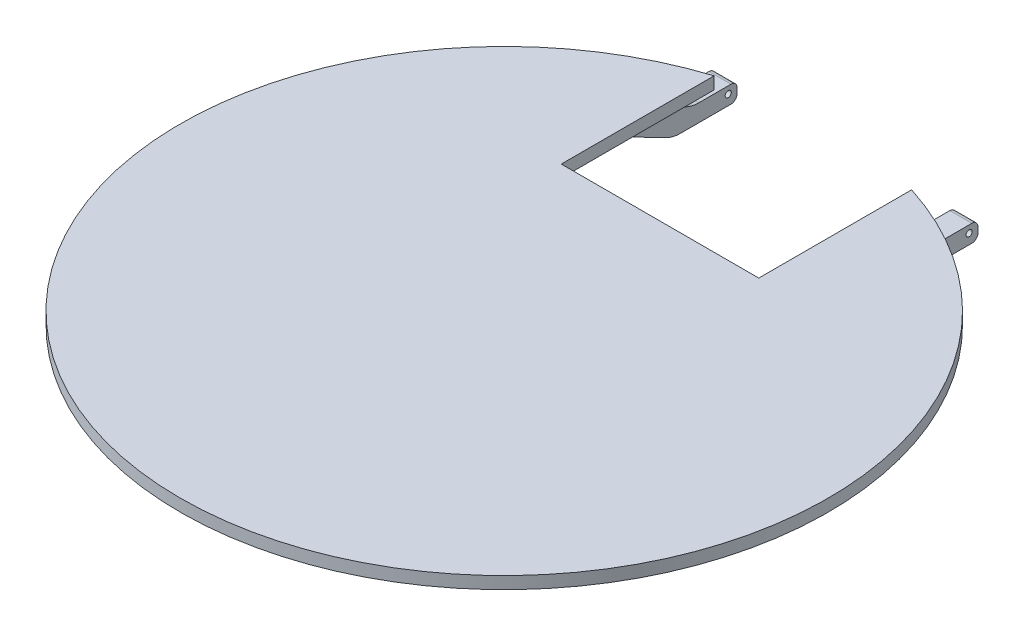
ISO-10303-21;
HEADER;
FILE_DESCRIPTION(('STEP AP214'),'2;1');
FILE_NAME('part.step','',(''),(''),'','','');
FILE_SCHEMA(('AUTOMOTIVE_DESIGN { 1 0 10303 214 1 1 1 1 }'));
ENDSEC;
DATA;
#1=APPLICATION_CONTEXT('core data for automotive mechanical design processes');
#2=APPLICATION_PROTOCOL_DEFINITION('international standard','automotive_design',2000,#1);
#3=PRODUCT_CONTEXT('',#1,'mechanical');
#4=PRODUCT('Part','Part','',(#3));
#5=PRODUCT_RELATED_PRODUCT_CATEGORY('part','',(#4));
#6=PRODUCT_DEFINITION_FORMATION('','',#4);
#7=PRODUCT_DEFINITION_CONTEXT('part definition',#1,'design');
#8=PRODUCT_DEFINITION('design','',#6,#7);
#9=PRODUCT_DEFINITION_SHAPE('','',#8);
#10=(LENGTH_UNIT() NAMED_UNIT(*) SI_UNIT(.MILLI.,.METRE.));
#11=(NAMED_UNIT(*) PLANE_ANGLE_UNIT() SI_UNIT($,.RADIAN.));
#12=(NAMED_UNIT(*) SI_UNIT($,.STERADIAN.) SOLID_ANGLE_UNIT());
#13=UNCERTAINTY_MEASURE_WITH_UNIT(LENGTH_MEASURE(1.E-05),#10,'distance_accuracy_value','');
#14=(GEOMETRIC_REPRESENTATION_CONTEXT(3) GLOBAL_UNCERTAINTY_ASSIGNED_CONTEXT((#13)) GLOBAL_UNIT_ASSIGNED_CONTEXT((#10,
#11,#12)) REPRESENTATION_CONTEXT('',''));
#15=CARTESIAN_POINT('',(0.,0.,0.));
#16=DIRECTION('',(0.,0.,1.));
#17=DIRECTION('',(1.,0.,0.));
#18=AXIS2_PLACEMENT_3D('',#15,#16,#17);
#19=CARTESIAN_POINT('',(-35.8,-6.63397180873605,-109.968629526497));
#20=DIRECTION('',(-1.,0.,0.));
#21=DIRECTION('',(0.,0.,1.));
#22=AXIS2_PLACEMENT_3D('',#19,#20,#21);
#23=CYLINDRICAL_SURFACE('',#22,2.);
#24=CARTESIAN_POINT('',(-43.,-6.63397180873605,-109.968629526497));
#25=DIRECTION('',(-1.,0.,0.));
#26=DIRECTION('',(0.,0.,1.));
#27=AXIS2_PLACEMENT_3D('',#24,#25,#26);
#28=CIRCLE('',#27,2.);
#29=CARTESIAN_POINT('',(-43.,-6.63397180873607,-111.968629526497));
#30=VERTEX_POINT('',#29);
#31=CARTESIAN_POINT('',(-43.,-4.63397180873605,-109.968629526497));
#32=VERTEX_POINT('',#31);
#33=EDGE_CURVE('E166',#30,#32,#28,.F.);
#34=ORIENTED_EDGE('',*,*,#33,.T.);
#35=DIRECTION('',(-1.,0.,0.));
#36=VECTOR('',#35,1.);
#37=CARTESIAN_POINT('',(-35.8,-4.63397180873605,-109.968629526497));
#38=LINE('',#37,#36);
#39=CARTESIAN_POINT('',(-35.8,-4.63397180873605,-109.968629526497));
#40=VERTEX_POINT('',#39);
#41=EDGE_CURVE('E12',#40,#32,#38,.T.);
#42=ORIENTED_EDGE('',*,*,#41,.F.);
#43=CARTESIAN_POINT('',(-35.8,-6.63397180873605,-109.968629526497));
#44=DIRECTION('',(-1.,0.,0.));
#45=DIRECTION('',(0.,0.,1.));
#46=AXIS2_PLACEMENT_3D('',#43,#44,#45);
#47=CIRCLE('',#46,2.);
#48=CARTESIAN_POINT('',(-35.8,-6.63397180873607,-111.968629526497));
#49=VERTEX_POINT('',#48);
#50=EDGE_CURVE('E188',#49,#40,#47,.F.);
#51=ORIENTED_EDGE('',*,*,#50,.F.);
#52=DIRECTION('',(-1.,0.,0.));
#53=VECTOR('',#52,1.);
#54=CARTESIAN_POINT('',(-35.8,-6.63397180873607,-111.968629526497));
#55=LINE('',#54,#53);
#56=EDGE_CURVE('E57',#49,#30,#55,.T.);
#57=ORIENTED_EDGE('',*,*,#56,.T.);
#58=EDGE_LOOP('',(#34,#42,#51,#57));
#59=FACE_BOUND('',#58,.T.);
#60=ADVANCED_FACE('F54',(#59),#23,.T.);
#61=CARTESIAN_POINT('',(-35.8,-4.63397180873605,0.));
#62=DIRECTION('',(0.,-1.,0.));
#63=DIRECTION('',(0.,0.,-1.));
#64=AXIS2_PLACEMENT_3D('',#61,#62,#63);
#65=PLANE('',#64);
#66=DIRECTION('',(0.,0.,1.));
#67=VECTOR('',#66,1.);
#68=CARTESIAN_POINT('',(-43.,-4.63397180873605,0.));
#69=LINE('',#68,#67);
#70=CARTESIAN_POINT('',(-43.,-4.63397180873605,-99.4675312207481));
#71=VERTEX_POINT('',#70);
#72=EDGE_CURVE('E103',#32,#71,#69,.T.);
#73=ORIENTED_EDGE('',*,*,#72,.T.);
#74=DIRECTION('',(-1.,0.,0.));
#75=VECTOR('',#74,1.);
#76=CARTESIAN_POINT('',(-35.8,-4.63397180873605,-99.4675312207481));
#77=LINE('',#76,#75);
#78=CARTESIAN_POINT('',(-35.8,-4.63397180873605,-99.4675312207481));
#79=VERTEX_POINT('',#78);
#80=EDGE_CURVE('E63',#79,#71,#77,.T.);
#81=ORIENTED_EDGE('',*,*,#80,.F.);
#82=DIRECTION('',(0.,0.,1.));
#83=VECTOR('',#82,1.);
#84=CARTESIAN_POINT('',(-35.8,-4.63397180873605,0.));
#85=LINE('',#84,#83);
#86=EDGE_CURVE('E71',#40,#79,#85,.T.);
#87=ORIENTED_EDGE('',*,*,#86,.F.);
#88=ORIENTED_EDGE('',*,*,#41,.T.);
#89=EDGE_LOOP('',(#73,#81,#87,#88));
#90=FACE_BOUND('',#89,.T.);
#91=ADVANCED_FACE('F229',(#90),#65,.F.);
#92=CARTESIAN_POINT('',(-35.8,5.36602819126395,-99.4675312207481));
#93=DIRECTION('',(-1.,0.,0.));
#94=DIRECTION('',(0.,0.,1.));
#95=AXIS2_PLACEMENT_3D('',#92,#93,#94);
#96=CYLINDRICAL_SURFACE('',#95,10.);
#97=CARTESIAN_POINT('',(-43.,5.36602819126395,-99.4675312207481));
#98=DIRECTION('',(-1.,0.,0.));
#99=DIRECTION('',(0.,0.,1.));
#100=AXIS2_PLACEMENT_3D('',#97,#98,#99);
#101=CIRCLE('',#100,10.);
#102=CARTESIAN_POINT('',(-43.,-0.854213860581016,-91.6375510920083));
#103=VERTEX_POINT('',#102);
#104=EDGE_CURVE('E148',#71,#103,#101,.T.);
#105=ORIENTED_EDGE('',*,*,#104,.T.);
#106=DIRECTION('',(-1.,0.,0.));
#107=VECTOR('',#106,1.);
#108=CARTESIAN_POINT('',(-35.8,-0.854213860581016,-91.6375510920083));
#109=LINE('',#108,#107);
#110=CARTESIAN_POINT('',(-35.8,-0.854213860581016,-91.6375510920083));
#111=VERTEX_POINT('',#110);
#112=EDGE_CURVE('E146',#111,#103,#109,.T.);
#113=ORIENTED_EDGE('',*,*,#112,.F.);
#114=CARTESIAN_POINT('',(-35.8,5.36602819126395,-99.4675312207481));
#115=DIRECTION('',(-1.,0.,0.));
#116=DIRECTION('',(0.,0.,1.));
#117=AXIS2_PLACEMENT_3D('',#114,#115,#116);
#118=CIRCLE('',#117,10.);
#119=EDGE_CURVE('E135',#79,#111,#118,.T.);
#120=ORIENTED_EDGE('',*,*,#119,.F.);
#121=ORIENTED_EDGE('',*,*,#80,.T.);
#122=EDGE_LOOP('',(#105,#113,#120,#121));
#123=FACE_BOUND('',#122,.T.);
#124=ADVANCED_FACE('F147',(#123),#96,.F.);
#125=CARTESIAN_POINT('',(-35.8,44.3009860685289,-55.7656499070269));
#126=DIRECTION('',(0.,-0.622024205184502,0.782998012873972));
#127=DIRECTION('',(0.,-0.782998012873972,-0.622024205184502));
#128=AXIS2_PLACEMENT_3D('',#125,#126,#127);
#129=PLANE('',#128);
#130=DIRECTION('',(0.,0.782998012873972,0.622024205184502));
#131=VECTOR('',#130,1.);
#132=CARTESIAN_POINT('',(-43.,44.3009860685289,-55.7656499070269));
#133=LINE('',#132,#131);
#134=CARTESIAN_POINT('',(-43.,0.,-90.9589520547832));
#135=VERTEX_POINT('',#134);
#136=EDGE_CURVE('E182',#103,#135,#133,.T.);
#137=ORIENTED_EDGE('',*,*,#136,.T.);
#138=DIRECTION('',(-1.,0.,0.));
#139=VECTOR('',#138,1.);
#140=CARTESIAN_POINT('',(-35.8,0.,-90.9589520547832));
#141=LINE('',#140,#139);
#142=CARTESIAN_POINT('',(-35.8,0.,-90.9589520547832));
#143=VERTEX_POINT('',#142);
#144=EDGE_CURVE('E152',#143,#135,#141,.T.);
#145=ORIENTED_EDGE('',*,*,#144,.F.);
#146=DIRECTION('',(0.,0.782998012873972,0.622024205184502));
#147=VECTOR('',#146,1.);
#148=CARTESIAN_POINT('',(-35.8,44.3009860685289,-55.7656499070269));
#149=LINE('',#148,#147);
#150=EDGE_CURVE('E141',#111,#143,#149,.T.);
#151=ORIENTED_EDGE('',*,*,#150,.F.);
#152=ORIENTED_EDGE('',*,*,#112,.T.);
#153=EDGE_LOOP('',(#137,#145,#151,#152));
#154=FACE_BOUND('',#153,.T.);
#155=ADVANCED_FACE('F154',(#154),#129,.F.);
#156=CARTESIAN_POINT('',(-35.8,0.,0.));
#157=DIRECTION('',(0.,1.,0.));
#158=DIRECTION('',(0.,0.,1.));
#159=AXIS2_PLACEMENT_3D('',#156,#157,#158);
#160=PLANE('',#159);
#161=DIRECTION('',(0.,0.,-1.));
#162=VECTOR('',#161,1.);
#163=CARTESIAN_POINT('',(-43.,0.,0.));
#164=LINE('',#163,#162);
#165=CARTESIAN_POINT('',(-43.,0.,-70.9589520547832));
#166=VERTEX_POINT('',#165);
#167=EDGE_CURVE('E179',#166,#135,#164,.T.);
#168=ORIENTED_EDGE('',*,*,#167,.F.);
#169=DIRECTION('',(-1.,0.,0.));
#170=VECTOR('',#169,1.);
#171=CARTESIAN_POINT('',(-35.8,0.,-70.9589520547832));
#172=LINE('',#171,#170);
#173=CARTESIAN_POINT('',(-35.8,0.,-70.9589520547832));
#174=VERTEX_POINT('',#173);
#175=EDGE_CURVE('E192',#174,#166,#172,.T.);
#176=ORIENTED_EDGE('',*,*,#175,.F.);
#177=DIRECTION('',(0.,0.,-1.));
#178=VECTOR('',#177,1.);
#179=CARTESIAN_POINT('',(-35.8,0.,0.));
#180=LINE('',#179,#178);
#181=EDGE_CURVE('E156',#174,#143,#180,.T.);
#182=ORIENTED_EDGE('',*,*,#181,.T.);
#183=ORIENTED_EDGE('',*,*,#144,.T.);
#184=EDGE_LOOP('',(#168,#176,#182,#183));
#185=FACE_BOUND('',#184,.T.);
#186=ADVANCED_FACE('F242',(#185),#160,.T.);
#187=CARTESIAN_POINT('',(-35.8,28.8860608717184,-14.8787792796203));
#188=DIRECTION('',(0.,0.888998595713218,-0.457909922168025));
#189=DIRECTION('',(0.,0.457909922168025,0.888998595713218));
#190=AXIS2_PLACEMENT_3D('',#187,#188,#189);
#191=PLANE('',#190);
#192=DIRECTION('',(0.,-0.457909922168025,-0.888998595713218));
#193=VECTOR('',#192,1.);
#194=CARTESIAN_POINT('',(-43.,28.8860608717184,-14.8787792796203));
#195=LINE('',#194,#193);
#196=CARTESIAN_POINT('',(-43.,-9.19168776804803,-88.8039410415705));
#197=VERTEX_POINT('',#196);
#198=EDGE_CURVE('E177',#166,#197,#195,.T.);
#199=ORIENTED_EDGE('',*,*,#198,.T.);
#200=DIRECTION('',(-1.,0.,0.));
#201=VECTOR('',#200,1.);
#202=CARTESIAN_POINT('',(-35.8,-9.19168776804803,-88.8039410415705));
#203=LINE('',#202,#201);
#204=CARTESIAN_POINT('',(-35.8,-9.19168776804803,-88.8039410415705));
#205=VERTEX_POINT('',#204);
#206=EDGE_CURVE('E194',#205,#197,#203,.T.);
#207=ORIENTED_EDGE('',*,*,#206,.F.);
#208=DIRECTION('',(0.,-0.457909922168025,-0.888998595713218));
#209=VECTOR('',#208,1.);
#210=CARTESIAN_POINT('',(-35.8,28.8860608717184,-14.8787792796203));
#211=LINE('',#210,#209);
#212=EDGE_CURVE('E158',#174,#205,#211,.T.);
#213=ORIENTED_EDGE('',*,*,#212,.F.);
#214=ORIENTED_EDGE('',*,*,#175,.T.);
#215=EDGE_LOOP('',(#199,#207,#213,#214));
#216=FACE_BOUND('',#215,.T.);
#217=ADVANCED_FACE('F245',(#216),#191,.F.);
#218=CARTESIAN_POINT('',(-35.8,-0.301701810915867,-93.3830402632507));
#219=DIRECTION('',(-1.,0.,0.));
#220=DIRECTION('',(0.,0.,1.));
#221=AXIS2_PLACEMENT_3D('',#218,#219,#220);
#222=CYLINDRICAL_SURFACE('',#221,10.);
#223=CARTESIAN_POINT('',(-43.,-0.301701810915867,-93.3830402632507));
#224=DIRECTION('',(-1.,0.,0.));
#225=DIRECTION('',(0.,0.,1.));
#226=AXIS2_PLACEMENT_3D('',#223,#224,#225);
#227=CIRCLE('',#226,10.);
#228=CARTESIAN_POINT('',(-43.,-10.3017018109159,-93.3830402632508));
#229=VERTEX_POINT('',#228);
#230=EDGE_CURVE('E175',#197,#229,#227,.F.);
#231=ORIENTED_EDGE('',*,*,#230,.T.);
#232=DIRECTION('',(-1.,0.,0.));
#233=VECTOR('',#232,1.);
#234=CARTESIAN_POINT('',(-35.8,-10.3017018109159,-93.3830402632508));
#235=LINE('',#234,#233);
#236=CARTESIAN_POINT('',(-35.8,-10.3017018109159,-93.3830402632508));
#237=VERTEX_POINT('',#236);
#238=EDGE_CURVE('E197',#237,#229,#235,.T.);
#239=ORIENTED_EDGE('',*,*,#238,.F.);
#240=CARTESIAN_POINT('',(-35.8,-0.301701810915867,-93.3830402632507));
#241=DIRECTION('',(-1.,0.,0.));
#242=DIRECTION('',(0.,0.,1.));
#243=AXIS2_PLACEMENT_3D('',#240,#241,#242);
#244=CIRCLE('',#243,10.);
#245=EDGE_CURVE('E266',#205,#237,#244,.F.);
#246=ORIENTED_EDGE('',*,*,#245,.F.);
#247=ORIENTED_EDGE('',*,*,#206,.T.);
#248=EDGE_LOOP('',(#231,#239,#246,#247));
#249=FACE_BOUND('',#248,.T.);
#250=ADVANCED_FACE('F249',(#249),#222,.T.);
#251=CARTESIAN_POINT('',(-35.8,-10.3017018109159,0.));
#252=DIRECTION('',(0.,1.,0.));
#253=DIRECTION('',(0.,0.,1.));
#254=AXIS2_PLACEMENT_3D('',#251,#252,#253);
#255=PLANE('',#254);
#256=DIRECTION('',(0.,0.,-1.));
#257=VECTOR('',#256,1.);
#258=CARTESIAN_POINT('',(-43.,-10.3017018109159,0.));
#259=LINE('',#258,#257);
#260=CARTESIAN_POINT('',(-43.,-10.3017018109159,-109.968629526497));
#261=VERTEX_POINT('',#260);
#262=EDGE_CURVE('E173',#229,#261,#259,.T.);
#263=ORIENTED_EDGE('',*,*,#262,.T.);
#264=DIRECTION('',(-1.,0.,0.));
#265=VECTOR('',#264,1.);
#266=CARTESIAN_POINT('',(-35.8,-10.3017018109159,-109.968629526497));
#267=LINE('',#266,#265);
#268=CARTESIAN_POINT('',(-35.8,-10.3017018109159,-109.968629526497));
#269=VERTEX_POINT('',#268);
#270=EDGE_CURVE('E200',#269,#261,#267,.T.);
#271=ORIENTED_EDGE('',*,*,#270,.F.);
#272=DIRECTION('',(0.,0.,-1.));
#273=VECTOR('',#272,1.);
#274=CARTESIAN_POINT('',(-35.8,-10.3017018109159,0.));
#275=LINE('',#274,#273);
#276=EDGE_CURVE('E264',#237,#269,#275,.T.);
#277=ORIENTED_EDGE('',*,*,#276,.F.);
#278=ORIENTED_EDGE('',*,*,#238,.T.);
#279=EDGE_LOOP('',(#263,#271,#277,#278));
#280=FACE_BOUND('',#279,.T.);
#281=ADVANCED_FACE('F225',(#280),#255,.F.);
#282=CARTESIAN_POINT('',(-35.8,-8.30170181091587,-109.968629526497));
#283=DIRECTION('',(-1.,0.,0.));
#284=DIRECTION('',(0.,0.,1.));
#285=AXIS2_PLACEMENT_3D('',#282,#283,#284);
#286=CYLINDRICAL_SURFACE('',#285,2.);
#287=CARTESIAN_POINT('',(-43.,-8.30170181091587,-109.968629526497));
#288=DIRECTION('',(-1.,0.,0.));
#289=DIRECTION('',(0.,0.,1.));
#290=AXIS2_PLACEMENT_3D('',#287,#288,#289);
#291=CIRCLE('',#290,2.);
#292=CARTESIAN_POINT('',(-43.,-8.30170181091585,-111.968629526497));
#293=VERTEX_POINT('',#292);
#294=EDGE_CURVE('E171',#261,#293,#291,.F.);
#295=ORIENTED_EDGE('',*,*,#294,.T.);
#296=DIRECTION('',(-1.,0.,0.));
#297=VECTOR('',#296,1.);
#298=CARTESIAN_POINT('',(-35.8,-8.30170181091585,-111.968629526497));
#299=LINE('',#298,#297);
#300=CARTESIAN_POINT('',(-35.8,-8.30170181091585,-111.968629526497));
#301=VERTEX_POINT('',#300);
#302=EDGE_CURVE('E202',#301,#293,#299,.T.);
#303=ORIENTED_EDGE('',*,*,#302,.F.);
#304=CARTESIAN_POINT('',(-35.8,-8.30170181091587,-109.968629526497));
#305=DIRECTION('',(-1.,0.,0.));
#306=DIRECTION('',(0.,0.,1.));
#307=AXIS2_PLACEMENT_3D('',#304,#305,#306);
#308=CIRCLE('',#307,2.);
#309=EDGE_CURVE('E263',#269,#301,#308,.F.);
#310=ORIENTED_EDGE('',*,*,#309,.F.);
#311=ORIENTED_EDGE('',*,*,#270,.T.);
#312=EDGE_LOOP('',(#295,#303,#310,#311));
#313=FACE_BOUND('',#312,.T.);
#314=ADVANCED_FACE('F218',(#313),#286,.T.);
#315=CARTESIAN_POINT('',(-35.8,0.,-111.968629526497));
#316=DIRECTION('',(0.,0.,1.));
#317=DIRECTION('',(1.,0.,0.));
#318=AXIS2_PLACEMENT_3D('',#315,#316,#317);
#319=PLANE('',#318);
#320=DIRECTION('',(0.,1.,0.));
#321=VECTOR('',#320,1.);
#322=CARTESIAN_POINT('',(-43.,0.,-111.968629526497));
#323=LINE('',#322,#321);
#324=EDGE_CURVE('E169',#293,#30,#323,.T.);
#325=ORIENTED_EDGE('',*,*,#324,.T.);
#326=ORIENTED_EDGE('',*,*,#56,.F.);
#327=DIRECTION('',(0.,1.,0.));
#328=VECTOR('',#327,1.);
#329=CARTESIAN_POINT('',(-35.8,0.,-111.968629526497));
#330=LINE('',#329,#328);
#331=EDGE_CURVE('E115',#301,#49,#330,.T.);
#332=ORIENTED_EDGE('',*,*,#331,.F.);
#333=ORIENTED_EDGE('',*,*,#302,.T.);
#334=EDGE_LOOP('',(#325,#326,#332,#333));
#335=FACE_BOUND('',#334,.T.);
#336=ADVANCED_FACE('F215',(#335),#319,.F.);
#337=CARTESIAN_POINT('',(-35.8,-7.,-109.068952054783));
#338=DIRECTION('',(-1.,0.,0.));
#339=DIRECTION('',(0.,0.,1.));
#340=AXIS2_PLACEMENT_3D('',#337,#338,#339);
#341=CYLINDRICAL_SURFACE('',#340,0.999999999999998);
#342=CARTESIAN_POINT('',(-35.8,-7.,-109.068952054783));
#343=DIRECTION('',(-1.,0.,0.));
#344=DIRECTION('',(0.,0.,1.));
#345=AXIS2_PLACEMENT_3D('',#342,#343,#344);
#346=CIRCLE('',#345,0.999999999999998);
#347=CARTESIAN_POINT('',(-35.8,-7.,-108.068952054783));
#348=VERTEX_POINT('',#347);
#349=EDGE_CURVE('E163',#348,#348,#346,.T.);
#350=ORIENTED_EDGE('',*,*,#349,.F.);
#351=EDGE_LOOP('',(#350));
#352=FACE_BOUND('',#351,.T.);
#353=CARTESIAN_POINT('',(-43.,-7.,-109.068952054783));
#354=DIRECTION('',(-1.,0.,0.));
#355=DIRECTION('',(0.,0.,1.));
#356=AXIS2_PLACEMENT_3D('',#353,#354,#355);
#357=CIRCLE('',#356,0.999999999999998);
#358=CARTESIAN_POINT('',(-43.,-7.,-108.068952054783));
#359=VERTEX_POINT('',#358);
#360=EDGE_CURVE('E186',#359,#359,#357,.T.);
#361=ORIENTED_EDGE('',*,*,#360,.T.);
#362=EDGE_LOOP('',(#361));
#363=FACE_BOUND('',#362,.T.);
#364=ADVANCED_FACE('F217',(#352,#363),#341,.F.);
#365=CARTESIAN_POINT('',(-35.8,0.,0.));
#366=DIRECTION('',(-1.,0.,0.));
#367=DIRECTION('',(0.,0.,1.));
#368=AXIS2_PLACEMENT_3D('',#365,#366,#367);
#369=PLANE('',#368);
#370=ORIENTED_EDGE('',*,*,#50,.T.);
#371=ORIENTED_EDGE('',*,*,#86,.T.);
#372=ORIENTED_EDGE('',*,*,#119,.T.);
#373=ORIENTED_EDGE('',*,*,#150,.T.);
#374=ORIENTED_EDGE('',*,*,#181,.F.);
#375=ORIENTED_EDGE('',*,*,#212,.T.);
#376=ORIENTED_EDGE('',*,*,#245,.T.);
#377=ORIENTED_EDGE('',*,*,#276,.T.);
#378=ORIENTED_EDGE('',*,*,#309,.T.);
#379=ORIENTED_EDGE('',*,*,#331,.T.);
#380=EDGE_LOOP('',(#370,#371,#372,#373,#374,#375,#376,#377,#378,#379));
#381=FACE_BOUND('',#380,.T.);
#382=ORIENTED_EDGE('',*,*,#349,.T.);
#383=EDGE_LOOP('',(#382));
#384=FACE_BOUND('',#383,.T.);
#385=ADVANCED_FACE('F137',(#381,#384),#369,.F.);
#386=CARTESIAN_POINT('',(-43.,0.,0.));
#387=DIRECTION('',(-1.,0.,0.));
#388=DIRECTION('',(0.,0.,1.));
#389=AXIS2_PLACEMENT_3D('',#386,#387,#388);
#390=PLANE('',#389);
#391=ORIENTED_EDGE('',*,*,#33,.F.);
#392=ORIENTED_EDGE('',*,*,#324,.F.);
#393=ORIENTED_EDGE('',*,*,#294,.F.);
#394=ORIENTED_EDGE('',*,*,#262,.F.);
#395=ORIENTED_EDGE('',*,*,#230,.F.);
#396=ORIENTED_EDGE('',*,*,#198,.F.);
#397=ORIENTED_EDGE('',*,*,#167,.T.);
#398=ORIENTED_EDGE('',*,*,#136,.F.);
#399=ORIENTED_EDGE('',*,*,#104,.F.);
#400=ORIENTED_EDGE('',*,*,#72,.F.);
#401=EDGE_LOOP('',(#391,#392,#393,#394,#395,#396,#397,#398,#399,#400));
#402=FACE_BOUND('',#401,.T.);
#403=ORIENTED_EDGE('',*,*,#360,.F.);
#404=EDGE_LOOP('',(#403));
#405=FACE_BOUND('',#404,.T.);
#406=ADVANCED_FACE('F211',(#402,#405),#390,.T.);
#407=CLOSED_SHELL('',(#60,#91,#124,#155,#186,#217,#250,#281,#314,#336,#364,#385,#406));
#408=MANIFOLD_SOLID_BREP('B2',#407);
#409=CARTESIAN_POINT('',(43.,-6.63397180873605,-109.968629526497));
#410=DIRECTION('',(-1.,0.,0.));
#411=DIRECTION('',(0.,0.,1.));
#412=AXIS2_PLACEMENT_3D('',#409,#410,#411);
#413=CYLINDRICAL_SURFACE('',#412,2.);
#414=CARTESIAN_POINT('',(35.8,-6.63397180873605,-109.968629526497));
#415=DIRECTION('',(-1.,0.,0.));
#416=DIRECTION('',(0.,0.,1.));
#417=AXIS2_PLACEMENT_3D('',#414,#415,#416);
#418=CIRCLE('',#417,2.);
#419=CARTESIAN_POINT('',(35.8,-6.63397180873607,-111.968629526497));
#420=VERTEX_POINT('',#419);
#421=CARTESIAN_POINT('',(35.8,-4.63397180873605,-109.968629526497));
#422=VERTEX_POINT('',#421);
#423=EDGE_CURVE('E479',#420,#422,#418,.F.);
#424=ORIENTED_EDGE('',*,*,#423,.T.);
#425=DIRECTION('',(-1.,0.,0.));
#426=VECTOR('',#425,1.);
#427=CARTESIAN_POINT('',(43.,-4.63397180873605,-109.968629526497));
#428=LINE('',#427,#426);
#429=CARTESIAN_POINT('',(43.,-4.63397180873605,-109.968629526497));
#430=VERTEX_POINT('',#429);
#431=EDGE_CURVE('E52',#430,#422,#428,.T.);
#432=ORIENTED_EDGE('',*,*,#431,.F.);
#433=CARTESIAN_POINT('',(43.,-6.63397180873605,-109.968629526497));
#434=DIRECTION('',(-1.,0.,0.));
#435=DIRECTION('',(0.,0.,1.));
#436=AXIS2_PLACEMENT_3D('',#433,#434,#435);
#437=CIRCLE('',#436,2.);
#438=CARTESIAN_POINT('',(43.,-6.63397180873607,-111.968629526497));
#439=VERTEX_POINT('',#438);
#440=EDGE_CURVE('E501',#439,#430,#437,.F.);
#441=ORIENTED_EDGE('',*,*,#440,.F.);
#442=DIRECTION('',(-1.,0.,0.));
#443=VECTOR('',#442,1.);
#444=CARTESIAN_POINT('',(43.,-6.63397180873607,-111.968629526497));
#445=LINE('',#444,#443);
#446=EDGE_CURVE('E370',#439,#420,#445,.T.);
#447=ORIENTED_EDGE('',*,*,#446,.T.);
#448=EDGE_LOOP('',(#424,#432,#441,#447));
#449=FACE_BOUND('',#448,.T.);
#450=ADVANCED_FACE('F367',(#449),#413,.T.);
#451=CARTESIAN_POINT('',(43.,-4.63397180873605,0.));
#452=DIRECTION('',(0.,-1.,0.));
#453=DIRECTION('',(0.,0.,-1.));
#454=AXIS2_PLACEMENT_3D('',#451,#452,#453);
#455=PLANE('',#454);
#456=DIRECTION('',(0.,0.,1.));
#457=VECTOR('',#456,1.);
#458=CARTESIAN_POINT('',(35.8,-4.63397180873605,0.));
#459=LINE('',#458,#457);
#460=CARTESIAN_POINT('',(35.8,-4.63397180873605,-99.4675312207481));
#461=VERTEX_POINT('',#460);
#462=EDGE_CURVE('E416',#422,#461,#459,.T.);
#463=ORIENTED_EDGE('',*,*,#462,.T.);
#464=DIRECTION('',(-1.,0.,0.));
#465=VECTOR('',#464,1.);
#466=CARTESIAN_POINT('',(43.,-4.63397180873605,-99.4675312207481));
#467=LINE('',#466,#465);
#468=CARTESIAN_POINT('',(43.,-4.63397180873605,-99.4675312207481));
#469=VERTEX_POINT('',#468);
#470=EDGE_CURVE('E376',#469,#461,#467,.T.);
#471=ORIENTED_EDGE('',*,*,#470,.F.);
#472=DIRECTION('',(0.,0.,1.));
#473=VECTOR('',#472,1.);
#474=CARTESIAN_POINT('',(43.,-4.63397180873605,0.));
#475=LINE('',#474,#473);
#476=EDGE_CURVE('E384',#430,#469,#475,.T.);
#477=ORIENTED_EDGE('',*,*,#476,.F.);
#478=ORIENTED_EDGE('',*,*,#431,.T.);
#479=EDGE_LOOP('',(#463,#471,#477,#478));
#480=FACE_BOUND('',#479,.T.);
#481=ADVANCED_FACE('F542',(#480),#455,.F.);
#482=CARTESIAN_POINT('',(43.,5.36602819126395,-99.4675312207481));
#483=DIRECTION('',(-1.,0.,0.));
#484=DIRECTION('',(0.,0.,1.));
#485=AXIS2_PLACEMENT_3D('',#482,#483,#484);
#486=CYLINDRICAL_SURFACE('',#485,10.);
#487=CARTESIAN_POINT('',(35.8,5.36602819126395,-99.4675312207481));
#488=DIRECTION('',(-1.,0.,0.));
#489=DIRECTION('',(0.,0.,1.));
#490=AXIS2_PLACEMENT_3D('',#487,#488,#489);
#491=CIRCLE('',#490,10.);
#492=CARTESIAN_POINT('',(35.8,-0.854213860581016,-91.6375510920083));
#493=VERTEX_POINT('',#492);
#494=EDGE_CURVE('E461',#461,#493,#491,.T.);
#495=ORIENTED_EDGE('',*,*,#494,.T.);
#496=DIRECTION('',(-1.,0.,0.));
#497=VECTOR('',#496,1.);
#498=CARTESIAN_POINT('',(43.,-0.854213860581016,-91.6375510920083));
#499=LINE('',#498,#497);
#500=CARTESIAN_POINT('',(43.,-0.854213860581016,-91.6375510920083));
#501=VERTEX_POINT('',#500);
#502=EDGE_CURVE('E459',#501,#493,#499,.T.);
#503=ORIENTED_EDGE('',*,*,#502,.F.);
#504=CARTESIAN_POINT('',(43.,5.36602819126395,-99.4675312207481));
#505=DIRECTION('',(-1.,0.,0.));
#506=DIRECTION('',(0.,0.,1.));
#507=AXIS2_PLACEMENT_3D('',#504,#505,#506);
#508=CIRCLE('',#507,10.);
#509=EDGE_CURVE('E448',#469,#501,#508,.T.);
#510=ORIENTED_EDGE('',*,*,#509,.F.);
#511=ORIENTED_EDGE('',*,*,#470,.T.);
#512=EDGE_LOOP('',(#495,#503,#510,#511));
#513=FACE_BOUND('',#512,.T.);
#514=ADVANCED_FACE('F460',(#513),#486,.F.);
#515=CARTESIAN_POINT('',(43.,44.3009860685289,-55.7656499070269));
#516=DIRECTION('',(0.,-0.622024205184502,0.782998012873972));
#517=DIRECTION('',(0.,-0.782998012873972,-0.622024205184502));
#518=AXIS2_PLACEMENT_3D('',#515,#516,#517);
#519=PLANE('',#518);
#520=DIRECTION('',(0.,0.782998012873972,0.622024205184502));
#521=VECTOR('',#520,1.);
#522=CARTESIAN_POINT('',(35.8,44.3009860685289,-55.7656499070269));
#523=LINE('',#522,#521);
#524=CARTESIAN_POINT('',(35.8,0.,-90.9589520547832));
#525=VERTEX_POINT('',#524);
#526=EDGE_CURVE('E495',#493,#525,#523,.T.);
#527=ORIENTED_EDGE('',*,*,#526,.T.);
#528=DIRECTION('',(-1.,0.,0.));
#529=VECTOR('',#528,1.);
#530=CARTESIAN_POINT('',(43.,0.,-90.9589520547832));
#531=LINE('',#530,#529);
#532=CARTESIAN_POINT('',(43.,0.,-90.9589520547832));
#533=VERTEX_POINT('',#532);
#534=EDGE_CURVE('E465',#533,#525,#531,.T.);
#535=ORIENTED_EDGE('',*,*,#534,.F.);
#536=DIRECTION('',(0.,0.782998012873972,0.622024205184502));
#537=VECTOR('',#536,1.);
#538=CARTESIAN_POINT('',(43.,44.3009860685289,-55.7656499070269));
#539=LINE('',#538,#537);
#540=EDGE_CURVE('E454',#501,#533,#539,.T.);
#541=ORIENTED_EDGE('',*,*,#540,.F.);
#542=ORIENTED_EDGE('',*,*,#502,.T.);
#543=EDGE_LOOP('',(#527,#535,#541,#542));
#544=FACE_BOUND('',#543,.T.);
#545=ADVANCED_FACE('F467',(#544),#519,.F.);
#546=CARTESIAN_POINT('',(43.,0.,0.));
#547=DIRECTION('',(0.,1.,0.));
#548=DIRECTION('',(0.,0.,1.));
#549=AXIS2_PLACEMENT_3D('',#546,#547,#548);
#550=PLANE('',#549);
#551=DIRECTION('',(0.,0.,-1.));
#552=VECTOR('',#551,1.);
#553=CARTESIAN_POINT('',(35.8,0.,0.));
#554=LINE('',#553,#552);
#555=CARTESIAN_POINT('',(35.8,0.,-70.9589520547832));
#556=VERTEX_POINT('',#555);
#557=EDGE_CURVE('E492',#556,#525,#554,.T.);
#558=ORIENTED_EDGE('',*,*,#557,.F.);
#559=DIRECTION('',(-1.,0.,0.));
#560=VECTOR('',#559,1.);
#561=CARTESIAN_POINT('',(43.,0.,-70.9589520547832));
#562=LINE('',#561,#560);
#563=CARTESIAN_POINT('',(43.,0.,-70.9589520547832));
#564=VERTEX_POINT('',#563);
#565=EDGE_CURVE('E505',#564,#556,#562,.T.);
#566=ORIENTED_EDGE('',*,*,#565,.F.);
#567=DIRECTION('',(0.,0.,-1.));
#568=VECTOR('',#567,1.);
#569=CARTESIAN_POINT('',(43.,0.,0.));
#570=LINE('',#569,#568);
#571=EDGE_CURVE('E469',#564,#533,#570,.T.);
#572=ORIENTED_EDGE('',*,*,#571,.T.);
#573=ORIENTED_EDGE('',*,*,#534,.T.);
#574=EDGE_LOOP('',(#558,#566,#572,#573));
#575=FACE_BOUND('',#574,.T.);
#576=ADVANCED_FACE('F555',(#575),#550,.T.);
#577=CARTESIAN_POINT('',(43.,28.8860608717184,-14.8787792796203));
#578=DIRECTION('',(0.,0.888998595713218,-0.457909922168025));
#579=DIRECTION('',(0.,0.457909922168025,0.888998595713218));
#580=AXIS2_PLACEMENT_3D('',#577,#578,#579);
#581=PLANE('',#580);
#582=DIRECTION('',(0.,-0.457909922168025,-0.888998595713218));
#583=VECTOR('',#582,1.);
#584=CARTESIAN_POINT('',(35.8,28.8860608717184,-14.8787792796203));
#585=LINE('',#584,#583);
#586=CARTESIAN_POINT('',(35.8,-9.19168776804803,-88.8039410415705));
#587=VERTEX_POINT('',#586);
#588=EDGE_CURVE('E490',#556,#587,#585,.T.);
#589=ORIENTED_EDGE('',*,*,#588,.T.);
#590=DIRECTION('',(-1.,0.,0.));
#591=VECTOR('',#590,1.);
#592=CARTESIAN_POINT('',(43.,-9.19168776804803,-88.8039410415705));
#593=LINE('',#592,#591);
#594=CARTESIAN_POINT('',(43.,-9.19168776804803,-88.8039410415705));
#595=VERTEX_POINT('',#594);
#596=EDGE_CURVE('E507',#595,#587,#593,.T.);
#597=ORIENTED_EDGE('',*,*,#596,.F.);
#598=DIRECTION('',(0.,-0.457909922168025,-0.888998595713218));
#599=VECTOR('',#598,1.);
#600=CARTESIAN_POINT('',(43.,28.8860608717184,-14.8787792796203));
#601=LINE('',#600,#599);
#602=EDGE_CURVE('E471',#564,#595,#601,.T.);
#603=ORIENTED_EDGE('',*,*,#602,.F.);
#604=ORIENTED_EDGE('',*,*,#565,.T.);
#605=EDGE_LOOP('',(#589,#597,#603,#604));
#606=FACE_BOUND('',#605,.T.);
#607=ADVANCED_FACE('F558',(#606),#581,.F.);
#608=CARTESIAN_POINT('',(43.,-0.301701810915867,-93.3830402632507));
#609=DIRECTION('',(-1.,0.,0.));
#610=DIRECTION('',(0.,0.,1.));
#611=AXIS2_PLACEMENT_3D('',#608,#609,#610);
#612=CYLINDRICAL_SURFACE('',#611,10.);
#613=CARTESIAN_POINT('',(35.8,-0.301701810915867,-93.3830402632507));
#614=DIRECTION('',(-1.,0.,0.));
#615=DIRECTION('',(0.,0.,1.));
#616=AXIS2_PLACEMENT_3D('',#613,#614,#615);
#617=CIRCLE('',#616,10.);
#618=CARTESIAN_POINT('',(35.8,-10.3017018109159,-93.3830402632508));
#619=VERTEX_POINT('',#618);
#620=EDGE_CURVE('E488',#587,#619,#617,.F.);
#621=ORIENTED_EDGE('',*,*,#620,.T.);
#622=DIRECTION('',(-1.,0.,0.));
#623=VECTOR('',#622,1.);
#624=CARTESIAN_POINT('',(43.,-10.3017018109159,-93.3830402632508));
#625=LINE('',#624,#623);
#626=CARTESIAN_POINT('',(43.,-10.3017018109159,-93.3830402632508));
#627=VERTEX_POINT('',#626);
#628=EDGE_CURVE('E510',#627,#619,#625,.T.);
#629=ORIENTED_EDGE('',*,*,#628,.F.);
#630=CARTESIAN_POINT('',(43.,-0.301701810915867,-93.3830402632507));
#631=DIRECTION('',(-1.,0.,0.));
#632=DIRECTION('',(0.,0.,1.));
#633=AXIS2_PLACEMENT_3D('',#630,#631,#632);
#634=CIRCLE('',#633,10.);
#635=EDGE_CURVE('E579',#595,#627,#634,.F.);
#636=ORIENTED_EDGE('',*,*,#635,.F.);
#637=ORIENTED_EDGE('',*,*,#596,.T.);
#638=EDGE_LOOP('',(#621,#629,#636,#637));
#639=FACE_BOUND('',#638,.T.);
#640=ADVANCED_FACE('F562',(#639),#612,.T.);
#641=CARTESIAN_POINT('',(43.,-10.3017018109159,0.));
#642=DIRECTION('',(0.,1.,0.));
#643=DIRECTION('',(0.,0.,1.));
#644=AXIS2_PLACEMENT_3D('',#641,#642,#643);
#645=PLANE('',#644);
#646=DIRECTION('',(0.,0.,-1.));
#647=VECTOR('',#646,1.);
#648=CARTESIAN_POINT('',(35.8,-10.3017018109159,0.));
#649=LINE('',#648,#647);
#650=CARTESIAN_POINT('',(35.8,-10.3017018109159,-109.968629526497));
#651=VERTEX_POINT('',#650);
#652=EDGE_CURVE('E486',#619,#651,#649,.T.);
#653=ORIENTED_EDGE('',*,*,#652,.T.);
#654=DIRECTION('',(-1.,0.,0.));
#655=VECTOR('',#654,1.);
#656=CARTESIAN_POINT('',(43.,-10.3017018109159,-109.968629526497));
#657=LINE('',#656,#655);
#658=CARTESIAN_POINT('',(43.,-10.3017018109159,-109.968629526497));
#659=VERTEX_POINT('',#658);
#660=EDGE_CURVE('E513',#659,#651,#657,.T.);
#661=ORIENTED_EDGE('',*,*,#660,.F.);
#662=DIRECTION('',(0.,0.,-1.));
#663=VECTOR('',#662,1.);
#664=CARTESIAN_POINT('',(43.,-10.3017018109159,0.));
#665=LINE('',#664,#663);
#666=EDGE_CURVE('E577',#627,#659,#665,.T.);
#667=ORIENTED_EDGE('',*,*,#666,.F.);
#668=ORIENTED_EDGE('',*,*,#628,.T.);
#669=EDGE_LOOP('',(#653,#661,#667,#668));
#670=FACE_BOUND('',#669,.T.);
#671=ADVANCED_FACE('F538',(#670),#645,.F.);
#672=CARTESIAN_POINT('',(43.,-8.30170181091587,-109.968629526497));
#673=DIRECTION('',(-1.,0.,0.));
#674=DIRECTION('',(0.,0.,1.));
#675=AXIS2_PLACEMENT_3D('',#672,#673,#674);
#676=CYLINDRICAL_SURFACE('',#675,2.);
#677=CARTESIAN_POINT('',(35.8,-8.30170181091587,-109.968629526497));
#678=DIRECTION('',(-1.,0.,0.));
#679=DIRECTION('',(0.,0.,1.));
#680=AXIS2_PLACEMENT_3D('',#677,#678,#679);
#681=CIRCLE('',#680,2.);
#682=CARTESIAN_POINT('',(35.8,-8.30170181091585,-111.968629526497));
#683=VERTEX_POINT('',#682);
#684=EDGE_CURVE('E484',#651,#683,#681,.F.);
#685=ORIENTED_EDGE('',*,*,#684,.T.);
#686=DIRECTION('',(-1.,0.,0.));
#687=VECTOR('',#686,1.);
#688=CARTESIAN_POINT('',(43.,-8.30170181091585,-111.968629526497));
#689=LINE('',#688,#687);
#690=CARTESIAN_POINT('',(43.,-8.30170181091585,-111.968629526497));
#691=VERTEX_POINT('',#690);
#692=EDGE_CURVE('E515',#691,#683,#689,.T.);
#693=ORIENTED_EDGE('',*,*,#692,.F.);
#694=CARTESIAN_POINT('',(43.,-8.30170181091587,-109.968629526497));
#695=DIRECTION('',(-1.,0.,0.));
#696=DIRECTION('',(0.,0.,1.));
#697=AXIS2_PLACEMENT_3D('',#694,#695,#696);
#698=CIRCLE('',#697,2.);
#699=EDGE_CURVE('E576',#659,#691,#698,.F.);
#700=ORIENTED_EDGE('',*,*,#699,.F.);
#701=ORIENTED_EDGE('',*,*,#660,.T.);
#702=EDGE_LOOP('',(#685,#693,#700,#701));
#703=FACE_BOUND('',#702,.T.);
#704=ADVANCED_FACE('F531',(#703),#676,.T.);
#705=CARTESIAN_POINT('',(43.,0.,-111.968629526497));
#706=DIRECTION('',(0.,0.,1.));
#707=DIRECTION('',(1.,0.,0.));
#708=AXIS2_PLACEMENT_3D('',#705,#706,#707);
#709=PLANE('',#708);
#710=DIRECTION('',(0.,1.,0.));
#711=VECTOR('',#710,1.);
#712=CARTESIAN_POINT('',(35.8,0.,-111.968629526497));
#713=LINE('',#712,#711);
#714=EDGE_CURVE('E482',#683,#420,#713,.T.);
#715=ORIENTED_EDGE('',*,*,#714,.T.);
#716=ORIENTED_EDGE('',*,*,#446,.F.);
#717=DIRECTION('',(0.,1.,0.));
#718=VECTOR('',#717,1.);
#719=CARTESIAN_POINT('',(43.,0.,-111.968629526497));
#720=LINE('',#719,#718);
#721=EDGE_CURVE('E428',#691,#439,#720,.T.);
#722=ORIENTED_EDGE('',*,*,#721,.F.);
#723=ORIENTED_EDGE('',*,*,#692,.T.);
#724=EDGE_LOOP('',(#715,#716,#722,#723));
#725=FACE_BOUND('',#724,.T.);
#726=ADVANCED_FACE('F528',(#725),#709,.F.);
#727=CARTESIAN_POINT('',(43.,-7.,-109.068952054783));
#728=DIRECTION('',(-1.,0.,0.));
#729=DIRECTION('',(0.,0.,1.));
#730=AXIS2_PLACEMENT_3D('',#727,#728,#729);
#731=CYLINDRICAL_SURFACE('',#730,0.999999999999998);
#732=CARTESIAN_POINT('',(43.,-7.,-109.068952054783));
#733=DIRECTION('',(-1.,0.,0.));
#734=DIRECTION('',(0.,0.,1.));
#735=AXIS2_PLACEMENT_3D('',#732,#733,#734);
#736=CIRCLE('',#735,0.999999999999998);
#737=CARTESIAN_POINT('',(43.,-7.,-108.068952054783));
#738=VERTEX_POINT('',#737);
#739=EDGE_CURVE('E476',#738,#738,#736,.T.);
#740=ORIENTED_EDGE('',*,*,#739,.F.);
#741=EDGE_LOOP('',(#740));
#742=FACE_BOUND('',#741,.T.);
#743=CARTESIAN_POINT('',(35.8,-7.,-109.068952054783));
#744=DIRECTION('',(-1.,0.,0.));
#745=DIRECTION('',(0.,0.,1.));
#746=AXIS2_PLACEMENT_3D('',#743,#744,#745);
#747=CIRCLE('',#746,0.999999999999998);
#748=CARTESIAN_POINT('',(35.8,-7.,-108.068952054783));
#749=VERTEX_POINT('',#748);
#750=EDGE_CURVE('E499',#749,#749,#747,.T.);
#751=ORIENTED_EDGE('',*,*,#750,.T.);
#752=EDGE_LOOP('',(#751));
#753=FACE_BOUND('',#752,.T.);
#754=ADVANCED_FACE('F530',(#742,#753),#731,.F.);
#755=CARTESIAN_POINT('',(43.,0.,0.));
#756=DIRECTION('',(-1.,0.,0.));
#757=DIRECTION('',(0.,0.,1.));
#758=AXIS2_PLACEMENT_3D('',#755,#756,#757);
#759=PLANE('',#758);
#760=ORIENTED_EDGE('',*,*,#440,.T.);
#761=ORIENTED_EDGE('',*,*,#476,.T.);
#762=ORIENTED_EDGE('',*,*,#509,.T.);
#763=ORIENTED_EDGE('',*,*,#540,.T.);
#764=ORIENTED_EDGE('',*,*,#571,.F.);
#765=ORIENTED_EDGE('',*,*,#602,.T.);
#766=ORIENTED_EDGE('',*,*,#635,.T.);
#767=ORIENTED_EDGE('',*,*,#666,.T.);
#768=ORIENTED_EDGE('',*,*,#699,.T.);
#769=ORIENTED_EDGE('',*,*,#721,.T.);
#770=EDGE_LOOP('',(#760,#761,#762,#763,#764,#765,#766,#767,#768,#769));
#771=FACE_BOUND('',#770,.T.);
#772=ORIENTED_EDGE('',*,*,#739,.T.);
#773=EDGE_LOOP('',(#772));
#774=FACE_BOUND('',#773,.T.);
#775=ADVANCED_FACE('F450',(#771,#774),#759,.F.);
#776=CARTESIAN_POINT('',(35.8,0.,0.));
#777=DIRECTION('',(-1.,0.,0.));
#778=DIRECTION('',(0.,0.,1.));
#779=AXIS2_PLACEMENT_3D('',#776,#777,#778);
#780=PLANE('',#779);
#781=ORIENTED_EDGE('',*,*,#423,.F.);
#782=ORIENTED_EDGE('',*,*,#714,.F.);
#783=ORIENTED_EDGE('',*,*,#684,.F.);
#784=ORIENTED_EDGE('',*,*,#652,.F.);
#785=ORIENTED_EDGE('',*,*,#620,.F.);
#786=ORIENTED_EDGE('',*,*,#588,.F.);
#787=ORIENTED_EDGE('',*,*,#557,.T.);
#788=ORIENTED_EDGE('',*,*,#526,.F.);
#789=ORIENTED_EDGE('',*,*,#494,.F.);
#790=ORIENTED_EDGE('',*,*,#462,.F.);
#791=EDGE_LOOP('',(#781,#782,#783,#784,#785,#786,#787,#788,#789,#790));
#792=FACE_BOUND('',#791,.T.);
#793=ORIENTED_EDGE('',*,*,#750,.F.);
#794=EDGE_LOOP('',(#793));
#795=FACE_BOUND('',#794,.T.);
#796=ADVANCED_FACE('F524',(#792,#795),#780,.T.);
#797=CLOSED_SHELL('',(#450,#481,#514,#545,#576,#607,#640,#671,#704,#726,#754,#775,#796));
#798=MANIFOLD_SOLID_BREP('B6',#797);
#799=CARTESIAN_POINT('',(0.,4.,0.));
#800=DIRECTION('',(0.,-1.,0.));
#801=DIRECTION('',(0.,0.,-1.));
#802=AXIS2_PLACEMENT_3D('',#799,#800,#801);
#803=CYLINDRICAL_SURFACE('',#802,106.);
#804=DIRECTION('',(0.,-1.,0.));
#805=VECTOR('',#804,1.);
#806=CARTESIAN_POINT('',(-97.7496803063826,0.0001,-41.));
#807=LINE('',#806,#805);
#808=CARTESIAN_POINT('',(-97.7496803063826,0.0001,-41.));
#809=VERTEX_POINT('',#808);
#810=CARTESIAN_POINT('',(-97.7496803063826,0.,-41.));
#811=VERTEX_POINT('',#810);
#812=EDGE_CURVE('E783',#809,#811,#807,.T.);
#813=ORIENTED_EDGE('',*,*,#812,.F.);
#814=CARTESIAN_POINT('',(0.,0.0001,0.));
#815=DIRECTION('',(0.,-1.,0.));
#816=DIRECTION('',(0.,0.,-1.));
#817=AXIS2_PLACEMENT_3D('',#814,#815,#816);
#818=CIRCLE('',#817,106.);
#819=CARTESIAN_POINT('',(-75.8946638440411,0.0001,74.));
#820=VERTEX_POINT('',#819);
#821=EDGE_CURVE('E764',#820,#809,#818,.T.);
#822=ORIENTED_EDGE('',*,*,#821,.F.);
#823=DIRECTION('',(0.,-1.,0.));
#824=VECTOR('',#823,1.);
#825=CARTESIAN_POINT('',(-75.8946638440411,0.0001,74.));
#826=LINE('',#825,#824);
#827=CARTESIAN_POINT('',(-75.8946638440411,0.,74.));
#828=VERTEX_POINT('',#827);
#829=EDGE_CURVE('E749',#820,#828,#826,.T.);
#830=ORIENTED_EDGE('',*,*,#829,.T.);
#831=CARTESIAN_POINT('',(0.,0.,0.));
#832=DIRECTION('',(0.,1.,0.));
#833=DIRECTION('',(0.,0.,1.));
#834=AXIS2_PLACEMENT_3D('',#831,#832,#833);
#835=CIRCLE('',#834,106.);
#836=CARTESIAN_POINT('',(32.3,0.,-100.958952054783));
#837=VERTEX_POINT('',#836);
#838=EDGE_CURVE('E808',#828,#837,#835,.T.);
#839=ORIENTED_EDGE('',*,*,#838,.T.);
#840=DIRECTION('',(0.,-1.,0.));
#841=VECTOR('',#840,1.);
#842=CARTESIAN_POINT('',(32.3,4.,-100.958952054783));
#843=LINE('',#842,#841);
#844=CARTESIAN_POINT('',(32.3,4.,-100.958952054783));
#845=VERTEX_POINT('',#844);
#846=EDGE_CURVE('E818',#845,#837,#843,.T.);
#847=ORIENTED_EDGE('',*,*,#846,.F.);
#848=CARTESIAN_POINT('',(0.,4.,0.));
#849=DIRECTION('',(0.,1.,0.));
#850=DIRECTION('',(0.,0.,1.));
#851=AXIS2_PLACEMENT_3D('',#848,#849,#850);
#852=CIRCLE('',#851,106.);
#853=CARTESIAN_POINT('',(-32.3,4.,-100.958952054783));
#854=VERTEX_POINT('',#853);
#855=EDGE_CURVE('E796',#854,#845,#852,.T.);
#856=ORIENTED_EDGE('',*,*,#855,.F.);
#857=DIRECTION('',(0.,-1.,0.));
#858=VECTOR('',#857,1.);
#859=CARTESIAN_POINT('',(-32.3,4.,-100.958952054783));
#860=LINE('',#859,#858);
#861=CARTESIAN_POINT('',(-32.3,0.,-100.958952054783));
#862=VERTEX_POINT('',#861);
#863=EDGE_CURVE('E680',#854,#862,#860,.T.);
#864=ORIENTED_EDGE('',*,*,#863,.T.);
#865=EDGE_CURVE('E809',#862,#811,#835,.T.);
#866=ORIENTED_EDGE('',*,*,#865,.T.);
#867=EDGE_LOOP('',(#813,#822,#830,#839,#847,#856,#864,#866));
#868=FACE_BOUND('',#867,.T.);
#869=ADVANCED_FACE('F671',(#868),#803,.T.);
#870=CARTESIAN_POINT('',(0.,0.,0.));
#871=DIRECTION('',(0.,1.,0.));
#872=DIRECTION('',(0.,0.,1.));
#873=AXIS2_PLACEMENT_3D('',#870,#871,#872);
#874=PLANE('',#873);
#875=DIRECTION('',(-1.,0.,0.));
#876=VECTOR('',#875,1.);
#877=CARTESIAN_POINT('',(0.,0.,-41.));
#878=LINE('',#877,#876);
#879=CARTESIAN_POINT('',(68.,0.,-41.));
#880=VERTEX_POINT('',#879);
#881=EDGE_CURVE('E759',#880,#811,#878,.T.);
#882=ORIENTED_EDGE('',*,*,#881,.T.);
#883=ORIENTED_EDGE('',*,*,#865,.F.);
#884=DIRECTION('',(0.,0.,1.));
#885=VECTOR('',#884,1.);
#886=CARTESIAN_POINT('',(-32.3,0.,0.));
#887=LINE('',#886,#885);
#888=CARTESIAN_POINT('',(-32.3,0.,-50.9589520547832));
#889=VERTEX_POINT('',#888);
#890=EDGE_CURVE('E804',#862,#889,#887,.T.);
#891=ORIENTED_EDGE('',*,*,#890,.T.);
#892=DIRECTION('',(1.,0.,0.));
#893=VECTOR('',#892,1.);
#894=CARTESIAN_POINT('',(0.,0.,-50.9589520547832));
#895=LINE('',#894,#893);
#896=CARTESIAN_POINT('',(32.3,0.,-50.9589520547832));
#897=VERTEX_POINT('',#896);
#898=EDGE_CURVE('E782',#889,#897,#895,.T.);
#899=ORIENTED_EDGE('',*,*,#898,.T.);
#900=DIRECTION('',(0.,0.,-1.));
#901=VECTOR('',#900,1.);
#902=CARTESIAN_POINT('',(32.3,0.,0.));
#903=LINE('',#902,#901);
#904=EDGE_CURVE('E792',#897,#837,#903,.T.);
#905=ORIENTED_EDGE('',*,*,#904,.T.);
#906=ORIENTED_EDGE('',*,*,#838,.F.);
#907=DIRECTION('',(-1.,0.,0.));
#908=VECTOR('',#907,1.);
#909=CARTESIAN_POINT('',(0.,0.,74.));
#910=LINE('',#909,#908);
#911=CARTESIAN_POINT('',(68.,0.,74.));
#912=VERTEX_POINT('',#911);
#913=EDGE_CURVE('E773',#912,#828,#910,.T.);
#914=ORIENTED_EDGE('',*,*,#913,.F.);
#915=DIRECTION('',(0.,0.,-1.));
#916=VECTOR('',#915,1.);
#917=CARTESIAN_POINT('',(68.,0.,0.));
#918=LINE('',#917,#916);
#919=EDGE_CURVE('E687',#912,#880,#918,.T.);
#920=ORIENTED_EDGE('',*,*,#919,.T.);
#921=EDGE_LOOP('',(#882,#883,#891,#899,#905,#906,#914,#920));
#922=FACE_BOUND('',#921,.T.);
#923=ADVANCED_FACE('F831',(#922),#874,.F.);
#924=CARTESIAN_POINT('',(0.,4.,-50.9589520547832));
#925=DIRECTION('',(0.,0.,-1.));
#926=DIRECTION('',(-1.,0.,0.));
#927=AXIS2_PLACEMENT_3D('',#924,#925,#926);
#928=PLANE('',#927);
#929=ORIENTED_EDGE('',*,*,#898,.F.);
#930=DIRECTION('',(0.,-1.,0.));
#931=VECTOR('',#930,1.);
#932=CARTESIAN_POINT('',(-32.3,4.,-50.9589520547832));
#933=LINE('',#932,#931);
#934=CARTESIAN_POINT('',(-32.3,4.,-50.9589520547832));
#935=VERTEX_POINT('',#934);
#936=EDGE_CURVE('E365',#935,#889,#933,.T.);
#937=ORIENTED_EDGE('',*,*,#936,.F.);
#938=DIRECTION('',(1.,0.,0.));
#939=VECTOR('',#938,1.);
#940=CARTESIAN_POINT('',(0.,4.,-50.9589520547832));
#941=LINE('',#940,#939);
#942=CARTESIAN_POINT('',(32.3,4.,-50.9589520547832));
#943=VERTEX_POINT('',#942);
#944=EDGE_CURVE('E788',#935,#943,#941,.T.);
#945=ORIENTED_EDGE('',*,*,#944,.T.);
#946=DIRECTION('',(0.,-1.,0.));
#947=VECTOR('',#946,1.);
#948=CARTESIAN_POINT('',(32.3,4.,-50.9589520547832));
#949=LINE('',#948,#947);
#950=EDGE_CURVE('E696',#943,#897,#949,.T.);
#951=ORIENTED_EDGE('',*,*,#950,.T.);
#952=EDGE_LOOP('',(#929,#937,#945,#951));
#953=FACE_BOUND('',#952,.T.);
#954=ADVANCED_FACE('F673',(#953),#928,.T.);
#955=CARTESIAN_POINT('',(-32.3,4.,0.));
#956=DIRECTION('',(1.,0.,0.));
#957=DIRECTION('',(0.,0.,-1.));
#958=AXIS2_PLACEMENT_3D('',#955,#956,#957);
#959=PLANE('',#958);
#960=ORIENTED_EDGE('',*,*,#890,.F.);
#961=ORIENTED_EDGE('',*,*,#863,.F.);
#962=DIRECTION('',(0.,0.,1.));
#963=VECTOR('',#962,1.);
#964=CARTESIAN_POINT('',(-32.3,4.,0.));
#965=LINE('',#964,#963);
#966=EDGE_CURVE('E791',#854,#935,#965,.T.);
#967=ORIENTED_EDGE('',*,*,#966,.T.);
#968=ORIENTED_EDGE('',*,*,#936,.T.);
#969=EDGE_LOOP('',(#960,#961,#967,#968));
#970=FACE_BOUND('',#969,.T.);
#971=ADVANCED_FACE('F832',(#970),#959,.T.);
#972=CARTESIAN_POINT('',(32.3,4.,0.));
#973=DIRECTION('',(-1.,0.,0.));
#974=DIRECTION('',(0.,0.,1.));
#975=AXIS2_PLACEMENT_3D('',#972,#973,#974);
#976=PLANE('',#975);
#977=ORIENTED_EDGE('',*,*,#904,.F.);
#978=ORIENTED_EDGE('',*,*,#950,.F.);
#979=DIRECTION('',(0.,0.,-1.));
#980=VECTOR('',#979,1.);
#981=CARTESIAN_POINT('',(32.3,4.,0.));
#982=LINE('',#981,#980);
#983=EDGE_CURVE('E799',#943,#845,#982,.T.);
#984=ORIENTED_EDGE('',*,*,#983,.T.);
#985=ORIENTED_EDGE('',*,*,#846,.T.);
#986=EDGE_LOOP('',(#977,#978,#984,#985));
#987=FACE_BOUND('',#986,.T.);
#988=ADVANCED_FACE('F834',(#987),#976,.T.);
#989=CARTESIAN_POINT('',(0.,4.,0.));
#990=DIRECTION('',(0.,1.,0.));
#991=DIRECTION('',(0.,0.,1.));
#992=AXIS2_PLACEMENT_3D('',#989,#990,#991);
#993=PLANE('',#992);
#994=ORIENTED_EDGE('',*,*,#944,.F.);
#995=ORIENTED_EDGE('',*,*,#966,.F.);
#996=ORIENTED_EDGE('',*,*,#855,.T.);
#997=ORIENTED_EDGE('',*,*,#983,.F.);
#998=EDGE_LOOP('',(#994,#995,#996,#997));
#999=FACE_BOUND('',#998,.T.);
#1000=ADVANCED_FACE('F846',(#999),#993,.T.);
#1001=CARTESIAN_POINT('',(68.,0.0001,0.));
#1002=DIRECTION('',(-1.,0.,0.));
#1003=DIRECTION('',(0.,0.,1.));
#1004=AXIS2_PLACEMENT_3D('',#1001,#1002,#1003);
#1005=PLANE('',#1004);
#1006=ORIENTED_EDGE('',*,*,#919,.F.);
#1007=DIRECTION('',(0.,-1.,0.));
#1008=VECTOR('',#1007,1.);
#1009=CARTESIAN_POINT('',(68.,0.0001,74.));
#1010=LINE('',#1009,#1008);
#1011=CARTESIAN_POINT('',(68.,0.0001,74.));
#1012=VERTEX_POINT('',#1011);
#1013=EDGE_CURVE('E740',#1012,#912,#1010,.T.);
#1014=ORIENTED_EDGE('',*,*,#1013,.F.);
#1015=DIRECTION('',(0.,0.,-1.));
#1016=VECTOR('',#1015,1.);
#1017=CARTESIAN_POINT('',(68.,0.0001,0.));
#1018=LINE('',#1017,#1016);
#1019=CARTESIAN_POINT('',(68.,0.0001,-41.));
#1020=VERTEX_POINT('',#1019);
#1021=EDGE_CURVE('E743',#1012,#1020,#1018,.T.);
#1022=ORIENTED_EDGE('',*,*,#1021,.T.);
#1023=DIRECTION('',(0.,-1.,0.));
#1024=VECTOR('',#1023,1.);
#1025=CARTESIAN_POINT('',(68.,0.0001,-41.));
#1026=LINE('',#1025,#1024);
#1027=EDGE_CURVE('E779',#1020,#880,#1026,.T.);
#1028=ORIENTED_EDGE('',*,*,#1027,.T.);
#1029=EDGE_LOOP('',(#1006,#1014,#1022,#1028));
#1030=FACE_BOUND('',#1029,.T.);
#1031=ADVANCED_FACE('F742',(#1030),#1005,.T.);
#1032=CARTESIAN_POINT('',(0.,0.0001,-41.));
#1033=DIRECTION('',(0.,0.,1.));
#1034=DIRECTION('',(1.,0.,0.));
#1035=AXIS2_PLACEMENT_3D('',#1032,#1033,#1034);
#1036=PLANE('',#1035);
#1037=ORIENTED_EDGE('',*,*,#881,.F.);
#1038=ORIENTED_EDGE('',*,*,#1027,.F.);
#1039=DIRECTION('',(-1.,0.,0.));
#1040=VECTOR('',#1039,1.);
#1041=CARTESIAN_POINT('',(0.,0.0001,-41.));
#1042=LINE('',#1041,#1040);
#1043=EDGE_CURVE('E750',#1020,#809,#1042,.T.);
#1044=ORIENTED_EDGE('',*,*,#1043,.T.);
#1045=ORIENTED_EDGE('',*,*,#812,.T.);
#1046=EDGE_LOOP('',(#1037,#1038,#1044,#1045));
#1047=FACE_BOUND('',#1046,.T.);
#1048=ADVANCED_FACE('F838',(#1047),#1036,.T.);
#1049=CARTESIAN_POINT('',(0.,0.0001,74.));
#1050=DIRECTION('',(0.,0.,1.));
#1051=DIRECTION('',(1.,0.,0.));
#1052=AXIS2_PLACEMENT_3D('',#1049,#1050,#1051);
#1053=PLANE('',#1052);
#1054=ORIENTED_EDGE('',*,*,#913,.T.);
#1055=ORIENTED_EDGE('',*,*,#829,.F.);
#1056=DIRECTION('',(-1.,0.,0.));
#1057=VECTOR('',#1056,1.);
#1058=CARTESIAN_POINT('',(0.,0.0001,74.));
#1059=LINE('',#1058,#1057);
#1060=EDGE_CURVE('E756',#1012,#820,#1059,.T.);
#1061=ORIENTED_EDGE('',*,*,#1060,.F.);
#1062=ORIENTED_EDGE('',*,*,#1013,.T.);
#1063=EDGE_LOOP('',(#1054,#1055,#1061,#1062));
#1064=FACE_BOUND('',#1063,.T.);
#1065=ADVANCED_FACE('F761',(#1064),#1053,.F.);
#1066=CARTESIAN_POINT('',(0.,0.0001,0.));
#1067=DIRECTION('',(0.,-1.,0.));
#1068=DIRECTION('',(0.,0.,-1.));
#1069=AXIS2_PLACEMENT_3D('',#1066,#1067,#1068);
#1070=PLANE('',#1069);
#1071=ORIENTED_EDGE('',*,*,#1021,.F.);
#1072=ORIENTED_EDGE('',*,*,#1060,.T.);
#1073=ORIENTED_EDGE('',*,*,#821,.T.);
#1074=ORIENTED_EDGE('',*,*,#1043,.F.);
#1075=EDGE_LOOP('',(#1071,#1072,#1073,#1074));
#1076=FACE_BOUND('',#1075,.T.);
#1077=ADVANCED_FACE('F754',(#1076),#1070,.T.);
#1078=CLOSED_SHELL('',(#869,#923,#954,#971,#988,#1000,#1031,#1048,#1065,#1077));
#1079=MANIFOLD_SOLID_BREP('B46',#1078);
#1080=ADVANCED_BREP_SHAPE_REPRESENTATION('',(#18,#408,#798,#1079),#14);
#1081=SHAPE_DEFINITION_REPRESENTATION(#9,#1080);
ENDSEC;
END-ISO-10303-21;
